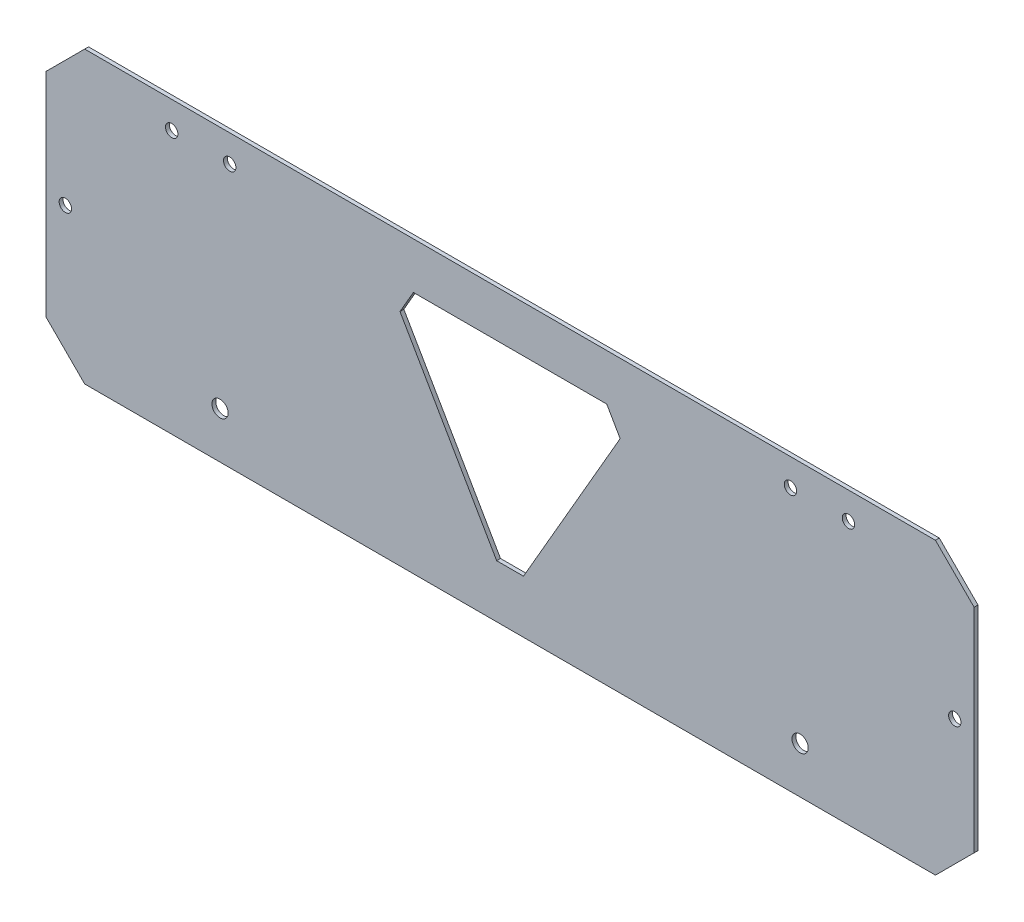
ISO-10303-21;
HEADER;
FILE_DESCRIPTION(('STEP AP214'),'2;1');
FILE_NAME('part.step','',(''),(''),'','','');
FILE_SCHEMA(('AUTOMOTIVE_DESIGN { 1 0 10303 214 1 1 1 1 }'));
ENDSEC;
DATA;
#1=APPLICATION_CONTEXT('core data for automotive mechanical design processes');
#2=APPLICATION_PROTOCOL_DEFINITION('international standard','automotive_design',2000,#1);
#3=PRODUCT_CONTEXT('',#1,'mechanical');
#4=PRODUCT('Part','Part','',(#3));
#5=PRODUCT_RELATED_PRODUCT_CATEGORY('part','',(#4));
#6=PRODUCT_DEFINITION_FORMATION('','',#4);
#7=PRODUCT_DEFINITION_CONTEXT('part definition',#1,'design');
#8=PRODUCT_DEFINITION('design','',#6,#7);
#9=PRODUCT_DEFINITION_SHAPE('','',#8);
#10=(LENGTH_UNIT() NAMED_UNIT(*) SI_UNIT(.MILLI.,.METRE.));
#11=(NAMED_UNIT(*) PLANE_ANGLE_UNIT() SI_UNIT($,.RADIAN.));
#12=(NAMED_UNIT(*) SI_UNIT($,.STERADIAN.) SOLID_ANGLE_UNIT());
#13=UNCERTAINTY_MEASURE_WITH_UNIT(LENGTH_MEASURE(1.E-05),#10,'distance_accuracy_value','');
#14=(GEOMETRIC_REPRESENTATION_CONTEXT(3) GLOBAL_UNCERTAINTY_ASSIGNED_CONTEXT((#13)) GLOBAL_UNIT_ASSIGNED_CONTEXT((#10,
#11,#12)) REPRESENTATION_CONTEXT('',''));
#15=CARTESIAN_POINT('',(0.,0.,0.));
#16=DIRECTION('',(0.,0.,1.));
#17=DIRECTION('',(1.,0.,0.));
#18=AXIS2_PLACEMENT_3D('',#15,#16,#17);
#19=CARTESIAN_POINT('',(0.,0.,1.));
#20=DIRECTION('',(0.,0.,-1.));
#21=DIRECTION('',(-1.,0.,0.));
#22=AXIS2_PLACEMENT_3D('',#19,#20,#21);
#23=PLANE('',#22);
#24=CARTESIAN_POINT('',(47.5,68.,0.999999999999999));
#25=DIRECTION('',(0.,0.,-1.));
#26=DIRECTION('',(-1.,0.,0.));
#27=AXIS2_PLACEMENT_3D('',#24,#25,#26);
#28=CIRCLE('',#27,1.59999999999999);
#29=CARTESIAN_POINT('',(45.9,68.,0.999999999999999));
#30=VERTEX_POINT('',#29);
#31=EDGE_CURVE('E165',#30,#30,#28,.T.);
#32=ORIENTED_EDGE('',*,*,#31,.T.);
#33=EDGE_LOOP('',(#32));
#34=FACE_BOUND('',#33,.T.);
#35=CARTESIAN_POINT('',(192.5,68.,0.999999999999999));
#36=DIRECTION('',(0.,0.,-1.));
#37=DIRECTION('',(-1.,0.,0.));
#38=AXIS2_PLACEMENT_3D('',#35,#36,#37);
#39=CIRCLE('',#38,1.59999999999999);
#40=CARTESIAN_POINT('',(190.9,68.,0.999999999999999));
#41=VERTEX_POINT('',#40);
#42=EDGE_CURVE('E242',#41,#41,#39,.T.);
#43=ORIENTED_EDGE('',*,*,#42,.T.);
#44=EDGE_LOOP('',(#43));
#45=FACE_BOUND('',#44,.T.);
#46=CARTESIAN_POINT('',(207.5,68.,0.999999999999999));
#47=DIRECTION('',(0.,0.,-1.));
#48=DIRECTION('',(-1.,0.,0.));
#49=AXIS2_PLACEMENT_3D('',#46,#47,#48);
#50=CIRCLE('',#49,1.59999999999999);
#51=CARTESIAN_POINT('',(205.9,68.,0.999999999999999));
#52=VERTEX_POINT('',#51);
#53=EDGE_CURVE('E239',#52,#52,#50,.T.);
#54=ORIENTED_EDGE('',*,*,#53,.T.);
#55=EDGE_LOOP('',(#54));
#56=FACE_BOUND('',#55,.T.);
#57=CARTESIAN_POINT('',(45.,12.,0.999999999999999));
#58=DIRECTION('',(0.,0.,-1.));
#59=DIRECTION('',(-1.,0.,0.));
#60=AXIS2_PLACEMENT_3D('',#57,#58,#59);
#61=CIRCLE('',#60,2.1);
#62=CARTESIAN_POINT('',(42.9,12.,0.999999999999999));
#63=VERTEX_POINT('',#62);
#64=EDGE_CURVE('E236',#63,#63,#61,.T.);
#65=ORIENTED_EDGE('',*,*,#64,.T.);
#66=EDGE_LOOP('',(#65));
#67=FACE_BOUND('',#66,.T.);
#68=CARTESIAN_POINT('',(32.5,68.,0.999999999999999));
#69=DIRECTION('',(0.,0.,-1.));
#70=DIRECTION('',(-1.,0.,0.));
#71=AXIS2_PLACEMENT_3D('',#68,#69,#70);
#72=CIRCLE('',#71,1.6);
#73=CARTESIAN_POINT('',(30.9,68.,0.999999999999999));
#74=VERTEX_POINT('',#73);
#75=EDGE_CURVE('E235',#74,#74,#72,.T.);
#76=ORIENTED_EDGE('',*,*,#75,.T.);
#77=EDGE_LOOP('',(#76));
#78=FACE_BOUND('',#77,.T.);
#79=CARTESIAN_POINT('',(235.,37.5,0.999999999999999));
#80=DIRECTION('',(0.,0.,-1.));
#81=DIRECTION('',(-1.,0.,0.));
#82=AXIS2_PLACEMENT_3D('',#79,#80,#81);
#83=CIRCLE('',#82,1.59999999999999);
#84=CARTESIAN_POINT('',(233.4,37.5,0.999999999999999));
#85=VERTEX_POINT('',#84);
#86=EDGE_CURVE('E226',#85,#85,#83,.T.);
#87=ORIENTED_EDGE('',*,*,#86,.T.);
#88=EDGE_LOOP('',(#87));
#89=FACE_BOUND('',#88,.T.);
#90=CARTESIAN_POINT('',(5.,37.5,0.999999999999999));
#91=DIRECTION('',(0.,0.,-1.));
#92=DIRECTION('',(-1.,0.,0.));
#93=AXIS2_PLACEMENT_3D('',#90,#91,#92);
#94=CIRCLE('',#93,1.6);
#95=CARTESIAN_POINT('',(3.4,37.5,0.999999999999999));
#96=VERTEX_POINT('',#95);
#97=EDGE_CURVE('E221',#96,#96,#94,.T.);
#98=ORIENTED_EDGE('',*,*,#97,.T.);
#99=EDGE_LOOP('',(#98));
#100=FACE_BOUND('',#99,.T.);
#101=CARTESIAN_POINT('',(195.,12.,0.999999999999999));
#102=DIRECTION('',(0.,0.,-1.));
#103=DIRECTION('',(-1.,0.,0.));
#104=AXIS2_PLACEMENT_3D('',#101,#102,#103);
#105=CIRCLE('',#104,2.09999999999999);
#106=CARTESIAN_POINT('',(192.9,12.,0.999999999999999));
#107=VERTEX_POINT('',#106);
#108=EDGE_CURVE('E219',#107,#107,#105,.T.);
#109=ORIENTED_EDGE('',*,*,#108,.T.);
#110=EDGE_LOOP('',(#109));
#111=FACE_BOUND('',#110,.T.);
#112=DIRECTION('',(0.,1.,0.));
#113=VECTOR('',#112,1.);
#114=CARTESIAN_POINT('',(240.,0.,1.));
#115=LINE('',#114,#113);
#116=CARTESIAN_POINT('',(240.,10.0000000000001,1.));
#117=VERTEX_POINT('',#116);
#118=CARTESIAN_POINT('',(240.,65.,1.));
#119=VERTEX_POINT('',#118);
#120=EDGE_CURVE('E297',#117,#119,#115,.T.);
#121=ORIENTED_EDGE('',*,*,#120,.T.);
#122=DIRECTION('',(0.707106781186548,-0.707106781186548,0.));
#123=VECTOR('',#122,1.);
#124=CARTESIAN_POINT('',(230.,75.,1.));
#125=LINE('',#124,#123);
#126=CARTESIAN_POINT('',(230.,75.,1.));
#127=VERTEX_POINT('',#126);
#128=EDGE_CURVE('E353',#119,#127,#125,.F.);
#129=ORIENTED_EDGE('',*,*,#128,.T.);
#130=DIRECTION('',(-1.,0.,0.));
#131=VECTOR('',#130,1.);
#132=CARTESIAN_POINT('',(0.,75.,1.));
#133=LINE('',#132,#131);
#134=CARTESIAN_POINT('',(10.,75.,1.));
#135=VERTEX_POINT('',#134);
#136=EDGE_CURVE('E302',#127,#135,#133,.T.);
#137=ORIENTED_EDGE('',*,*,#136,.T.);
#138=DIRECTION('',(0.707106781186548,0.707106781186548,0.));
#139=VECTOR('',#138,1.);
#140=CARTESIAN_POINT('',(0.,65.,1.));
#141=LINE('',#140,#139);
#142=CARTESIAN_POINT('',(0.,65.,1.));
#143=VERTEX_POINT('',#142);
#144=EDGE_CURVE('E350',#135,#143,#141,.F.);
#145=ORIENTED_EDGE('',*,*,#144,.T.);
#146=DIRECTION('',(0.,-1.,0.));
#147=VECTOR('',#146,1.);
#148=CARTESIAN_POINT('',(0.,0.,1.));
#149=LINE('',#148,#147);
#150=CARTESIAN_POINT('',(0.,10.,1.));
#151=VERTEX_POINT('',#150);
#152=EDGE_CURVE('E291',#143,#151,#149,.T.);
#153=ORIENTED_EDGE('',*,*,#152,.T.);
#154=DIRECTION('',(-0.707106781186548,0.707106781186548,0.));
#155=VECTOR('',#154,1.);
#156=CARTESIAN_POINT('',(10.,0.,1.));
#157=LINE('',#156,#155);
#158=CARTESIAN_POINT('',(10.,0.,1.));
#159=VERTEX_POINT('',#158);
#160=EDGE_CURVE('E72',#151,#159,#157,.F.);
#161=ORIENTED_EDGE('',*,*,#160,.T.);
#162=DIRECTION('',(1.,0.,0.));
#163=VECTOR('',#162,1.);
#164=CARTESIAN_POINT('',(0.,0.,1.));
#165=LINE('',#164,#163);
#166=CARTESIAN_POINT('',(230.,0.,1.));
#167=VERTEX_POINT('',#166);
#168=EDGE_CURVE('E298',#159,#167,#165,.T.);
#169=ORIENTED_EDGE('',*,*,#168,.T.);
#170=DIRECTION('',(-0.707106781186548,-0.707106781186548,0.));
#171=VECTOR('',#170,1.);
#172=CARTESIAN_POINT('',(240.,10.0000000000001,1.));
#173=LINE('',#172,#171);
#174=EDGE_CURVE('E355',#167,#117,#173,.F.);
#175=ORIENTED_EDGE('',*,*,#174,.T.);
#176=EDGE_LOOP('',(#121,#129,#137,#145,#153,#161,#169,#175));
#177=FACE_BOUND('',#176,.T.);
#178=DIRECTION('',(0.500000000000001,0.866025403784438,0.));
#179=VECTOR('',#178,1.);
#180=CARTESIAN_POINT('',(86.6746824526943,-50.0416512459885,1.));
#181=LINE('',#180,#179);
#182=CARTESIAN_POINT('',(123.469655114603,13.6891108675447,1.));
#183=VERTEX_POINT('',#182);
#184=CARTESIAN_POINT('',(148.469655114603,56.9903810567666,0.999999999999999));
#185=VERTEX_POINT('',#184);
#186=EDGE_CURVE('E286',#183,#185,#181,.T.);
#187=ORIENTED_EDGE('',*,*,#186,.F.);
#188=DIRECTION('',(-1.,0.,0.));
#189=VECTOR('',#188,1.);
#190=CARTESIAN_POINT('',(123.469655114603,13.6891108675447,1.));
#191=LINE('',#190,#189);
#192=CARTESIAN_POINT('',(116.530344885397,13.6891108675447,1.));
#193=VERTEX_POINT('',#192);
#194=EDGE_CURVE('E175',#183,#193,#191,.T.);
#195=ORIENTED_EDGE('',*,*,#194,.T.);
#196=DIRECTION('',(-0.500000000000001,0.866025403784438,0.));
#197=VECTOR('',#196,1.);
#198=CARTESIAN_POINT('',(93.3253175473054,53.8813972081442,1.));
#199=LINE('',#198,#197);
#200=CARTESIAN_POINT('',(91.5303448853971,56.9903810567666,0.999999999999999));
#201=VERTEX_POINT('',#200);
#202=EDGE_CURVE('E270',#193,#201,#199,.T.);
#203=ORIENTED_EDGE('',*,*,#202,.T.);
#204=DIRECTION('',(0.5,0.866025403784438,0.));
#205=VECTOR('',#204,1.);
#206=CARTESIAN_POINT('',(43.9701997807901,-25.3862066797608,1.));
#207=LINE('',#206,#205);
#208=CARTESIAN_POINT('',(94.9999999999999,63.,0.999999999999999));
#209=VERTEX_POINT('',#208);
#210=EDGE_CURVE('E276',#201,#209,#207,.T.);
#211=ORIENTED_EDGE('',*,*,#210,.T.);
#212=DIRECTION('',(-1.,0.,0.));
#213=VECTOR('',#212,1.);
#214=CARTESIAN_POINT('',(0.,63.,1.));
#215=LINE('',#214,#213);
#216=CARTESIAN_POINT('',(145.,63.,0.999999999999999));
#217=VERTEX_POINT('',#216);
#218=EDGE_CURVE('E283',#217,#209,#215,.T.);
#219=ORIENTED_EDGE('',*,*,#218,.F.);
#220=DIRECTION('',(-0.5,0.866025403784438,0.));
#221=VECTOR('',#220,1.);
#222=CARTESIAN_POINT('',(136.02980021921,78.5368417743719,1.));
#223=LINE('',#222,#221);
#224=EDGE_CURVE('E287',#185,#217,#223,.T.);
#225=ORIENTED_EDGE('',*,*,#224,.F.);
#226=EDGE_LOOP('',(#187,#195,#203,#211,#219,#225));
#227=FACE_BOUND('',#226,.T.);
#228=ADVANCED_FACE('F50',(#34,#45,#56,#67,#78,#89,#100,#111,#177,#227),#23,.F.);
#229=CARTESIAN_POINT('',(0.,0.,0.));
#230=DIRECTION('',(0.,0.,-1.));
#231=DIRECTION('',(-1.,0.,0.));
#232=AXIS2_PLACEMENT_3D('',#229,#230,#231);
#233=PLANE('',#232);
#234=DIRECTION('',(-0.500000000000001,0.866025403784438,0.));
#235=VECTOR('',#234,1.);
#236=CARTESIAN_POINT('',(93.3253175473054,53.8813972081442,0.));
#237=LINE('',#236,#235);
#238=CARTESIAN_POINT('',(116.530344885397,13.6891108675447,0.));
#239=VERTEX_POINT('',#238);
#240=CARTESIAN_POINT('',(91.5303448853971,56.9903810567666,0.));
#241=VERTEX_POINT('',#240);
#242=EDGE_CURVE('E161',#239,#241,#237,.T.);
#243=ORIENTED_EDGE('',*,*,#242,.F.);
#244=DIRECTION('',(-1.,0.,0.));
#245=VECTOR('',#244,1.);
#246=CARTESIAN_POINT('',(123.469655114603,13.6891108675447,0.));
#247=LINE('',#246,#245);
#248=CARTESIAN_POINT('',(123.469655114603,13.6891108675447,0.));
#249=VERTEX_POINT('',#248);
#250=EDGE_CURVE('E167',#249,#239,#247,.T.);
#251=ORIENTED_EDGE('',*,*,#250,.F.);
#252=DIRECTION('',(0.500000000000001,0.866025403784438,0.));
#253=VECTOR('',#252,1.);
#254=CARTESIAN_POINT('',(86.6746824526943,-50.0416512459885,0.));
#255=LINE('',#254,#253);
#256=CARTESIAN_POINT('',(148.469655114603,56.9903810567666,0.));
#257=VERTEX_POINT('',#256);
#258=EDGE_CURVE('E151',#249,#257,#255,.T.);
#259=ORIENTED_EDGE('',*,*,#258,.T.);
#260=DIRECTION('',(-0.5,0.866025403784438,0.));
#261=VECTOR('',#260,1.);
#262=CARTESIAN_POINT('',(136.02980021921,78.5368417743719,0.));
#263=LINE('',#262,#261);
#264=CARTESIAN_POINT('',(145.,63.,0.));
#265=VERTEX_POINT('',#264);
#266=EDGE_CURVE('E261',#257,#265,#263,.T.);
#267=ORIENTED_EDGE('',*,*,#266,.T.);
#268=DIRECTION('',(-1.,0.,0.));
#269=VECTOR('',#268,1.);
#270=CARTESIAN_POINT('',(0.,63.,0.));
#271=LINE('',#270,#269);
#272=CARTESIAN_POINT('',(94.9999999999999,63.,0.));
#273=VERTEX_POINT('',#272);
#274=EDGE_CURVE('E260',#265,#273,#271,.T.);
#275=ORIENTED_EDGE('',*,*,#274,.T.);
#276=DIRECTION('',(0.5,0.866025403784438,0.));
#277=VECTOR('',#276,1.);
#278=CARTESIAN_POINT('',(43.9701997807901,-25.3862066797608,0.));
#279=LINE('',#278,#277);
#280=EDGE_CURVE('E254',#241,#273,#279,.T.);
#281=ORIENTED_EDGE('',*,*,#280,.F.);
#282=EDGE_LOOP('',(#243,#251,#259,#267,#275,#281));
#283=FACE_BOUND('',#282,.T.);
#284=CARTESIAN_POINT('',(47.5,68.,0.));
#285=DIRECTION('',(0.,0.,-1.));
#286=DIRECTION('',(1.,0.,0.));
#287=AXIS2_PLACEMENT_3D('',#284,#285,#286);
#288=CIRCLE('',#287,1.59999999999999);
#289=CARTESIAN_POINT('',(49.1,68.,0.));
#290=VERTEX_POINT('',#289);
#291=EDGE_CURVE('E194',#290,#290,#288,.T.);
#292=ORIENTED_EDGE('',*,*,#291,.F.);
#293=EDGE_LOOP('',(#292));
#294=FACE_BOUND('',#293,.T.);
#295=CARTESIAN_POINT('',(192.5,68.,0.));
#296=DIRECTION('',(0.,0.,-1.));
#297=DIRECTION('',(-1.,0.,0.));
#298=AXIS2_PLACEMENT_3D('',#295,#296,#297);
#299=CIRCLE('',#298,1.59999999999999);
#300=CARTESIAN_POINT('',(190.9,68.,0.));
#301=VERTEX_POINT('',#300);
#302=EDGE_CURVE('E202',#301,#301,#299,.T.);
#303=ORIENTED_EDGE('',*,*,#302,.F.);
#304=EDGE_LOOP('',(#303));
#305=FACE_BOUND('',#304,.T.);
#306=CARTESIAN_POINT('',(207.5,68.,0.));
#307=DIRECTION('',(0.,0.,-1.));
#308=DIRECTION('',(-1.,0.,0.));
#309=AXIS2_PLACEMENT_3D('',#306,#307,#308);
#310=CIRCLE('',#309,1.59999999999999);
#311=CARTESIAN_POINT('',(205.9,68.,0.));
#312=VERTEX_POINT('',#311);
#313=EDGE_CURVE('E203',#312,#312,#310,.T.);
#314=ORIENTED_EDGE('',*,*,#313,.F.);
#315=EDGE_LOOP('',(#314));
#316=FACE_BOUND('',#315,.T.);
#317=CARTESIAN_POINT('',(45.,12.,0.));
#318=DIRECTION('',(0.,0.,-1.));
#319=DIRECTION('',(-1.,0.,0.));
#320=AXIS2_PLACEMENT_3D('',#317,#318,#319);
#321=CIRCLE('',#320,2.1);
#322=CARTESIAN_POINT('',(42.9,12.,0.));
#323=VERTEX_POINT('',#322);
#324=EDGE_CURVE('E209',#323,#323,#321,.T.);
#325=ORIENTED_EDGE('',*,*,#324,.F.);
#326=EDGE_LOOP('',(#325));
#327=FACE_BOUND('',#326,.T.);
#328=CARTESIAN_POINT('',(32.5,68.,0.));
#329=DIRECTION('',(0.,0.,-1.));
#330=DIRECTION('',(1.,0.,0.));
#331=AXIS2_PLACEMENT_3D('',#328,#329,#330);
#332=CIRCLE('',#331,1.6);
#333=CARTESIAN_POINT('',(34.1,68.,0.));
#334=VERTEX_POINT('',#333);
#335=EDGE_CURVE('E186',#334,#334,#332,.T.);
#336=ORIENTED_EDGE('',*,*,#335,.F.);
#337=EDGE_LOOP('',(#336));
#338=FACE_BOUND('',#337,.T.);
#339=CARTESIAN_POINT('',(235.,37.5,0.));
#340=DIRECTION('',(0.,0.,-1.));
#341=DIRECTION('',(-1.,0.,0.));
#342=AXIS2_PLACEMENT_3D('',#339,#340,#341);
#343=CIRCLE('',#342,1.59999999999999);
#344=CARTESIAN_POINT('',(233.4,37.5,0.));
#345=VERTEX_POINT('',#344);
#346=EDGE_CURVE('E191',#345,#345,#343,.T.);
#347=ORIENTED_EDGE('',*,*,#346,.F.);
#348=EDGE_LOOP('',(#347));
#349=FACE_BOUND('',#348,.T.);
#350=CARTESIAN_POINT('',(5.,37.5,0.));
#351=DIRECTION('',(0.,0.,-1.));
#352=DIRECTION('',(-1.,0.,0.));
#353=AXIS2_PLACEMENT_3D('',#350,#351,#352);
#354=CIRCLE('',#353,1.6);
#355=CARTESIAN_POINT('',(3.4,37.5,0.));
#356=VERTEX_POINT('',#355);
#357=EDGE_CURVE('E190',#356,#356,#354,.T.);
#358=ORIENTED_EDGE('',*,*,#357,.F.);
#359=EDGE_LOOP('',(#358));
#360=FACE_BOUND('',#359,.T.);
#361=CARTESIAN_POINT('',(195.,12.,0.));
#362=DIRECTION('',(0.,0.,-1.));
#363=DIRECTION('',(-1.,0.,0.));
#364=AXIS2_PLACEMENT_3D('',#361,#362,#363);
#365=CIRCLE('',#364,2.09999999999999);
#366=CARTESIAN_POINT('',(192.9,12.,0.));
#367=VERTEX_POINT('',#366);
#368=EDGE_CURVE('E214',#367,#367,#365,.T.);
#369=ORIENTED_EDGE('',*,*,#368,.F.);
#370=EDGE_LOOP('',(#369));
#371=FACE_BOUND('',#370,.T.);
#372=DIRECTION('',(-1.,0.,0.));
#373=VECTOR('',#372,1.);
#374=CARTESIAN_POINT('',(0.,75.,0.));
#375=LINE('',#374,#373);
#376=CARTESIAN_POINT('',(230.,75.,0.));
#377=VERTEX_POINT('',#376);
#378=CARTESIAN_POINT('',(10.,75.,0.));
#379=VERTEX_POINT('',#378);
#380=EDGE_CURVE('E300',#377,#379,#375,.T.);
#381=ORIENTED_EDGE('',*,*,#380,.F.);
#382=DIRECTION('',(-0.707106781186548,0.707106781186548,0.));
#383=VECTOR('',#382,1.);
#384=CARTESIAN_POINT('',(152.5,152.5,0.));
#385=LINE('',#384,#383);
#386=CARTESIAN_POINT('',(240.,65.,0.));
#387=VERTEX_POINT('',#386);
#388=EDGE_CURVE('E340',#377,#387,#385,.F.);
#389=ORIENTED_EDGE('',*,*,#388,.T.);
#390=DIRECTION('',(0.,1.,0.));
#391=VECTOR('',#390,1.);
#392=CARTESIAN_POINT('',(240.,0.,0.));
#393=LINE('',#392,#391);
#394=CARTESIAN_POINT('',(240.,10.0000000000001,0.));
#395=VERTEX_POINT('',#394);
#396=EDGE_CURVE('E314',#395,#387,#393,.T.);
#397=ORIENTED_EDGE('',*,*,#396,.F.);
#398=DIRECTION('',(0.707106781186548,0.707106781186548,0.));
#399=VECTOR('',#398,1.);
#400=CARTESIAN_POINT('',(115.,-115.,0.));
#401=LINE('',#400,#399);
#402=CARTESIAN_POINT('',(230.,0.,0.));
#403=VERTEX_POINT('',#402);
#404=EDGE_CURVE('E331',#395,#403,#401,.F.);
#405=ORIENTED_EDGE('',*,*,#404,.T.);
#406=DIRECTION('',(1.,0.,0.));
#407=VECTOR('',#406,1.);
#408=CARTESIAN_POINT('',(0.,0.,0.));
#409=LINE('',#408,#407);
#410=CARTESIAN_POINT('',(10.,0.,0.));
#411=VERTEX_POINT('',#410);
#412=EDGE_CURVE('E315',#411,#403,#409,.T.);
#413=ORIENTED_EDGE('',*,*,#412,.F.);
#414=DIRECTION('',(0.707106781186548,-0.707106781186548,0.));
#415=VECTOR('',#414,1.);
#416=CARTESIAN_POINT('',(5.00000000000002,5.00000000000002,0.));
#417=LINE('',#416,#415);
#418=CARTESIAN_POINT('',(0.,10.,0.));
#419=VERTEX_POINT('',#418);
#420=EDGE_CURVE('E332',#411,#419,#417,.F.);
#421=ORIENTED_EDGE('',*,*,#420,.T.);
#422=DIRECTION('',(0.,-1.,0.));
#423=VECTOR('',#422,1.);
#424=CARTESIAN_POINT('',(0.,0.,0.));
#425=LINE('',#424,#423);
#426=CARTESIAN_POINT('',(0.,65.,0.));
#427=VERTEX_POINT('',#426);
#428=EDGE_CURVE('E292',#427,#419,#425,.T.);
#429=ORIENTED_EDGE('',*,*,#428,.F.);
#430=DIRECTION('',(-0.707106781186548,-0.707106781186548,0.));
#431=VECTOR('',#430,1.);
#432=CARTESIAN_POINT('',(-32.5,32.5,0.));
#433=LINE('',#432,#431);
#434=EDGE_CURVE('E328',#427,#379,#433,.F.);
#435=ORIENTED_EDGE('',*,*,#434,.T.);
#436=EDGE_LOOP('',(#381,#389,#397,#405,#413,#421,#429,#435));
#437=FACE_BOUND('',#436,.T.);
#438=ADVANCED_FACE('F176',(#283,#294,#305,#316,#327,#338,#349,#360,#371,#437),#233,.T.);
#439=CARTESIAN_POINT('',(0.,0.,1.));
#440=DIRECTION('',(1.,0.,0.));
#441=DIRECTION('',(0.,0.,-1.));
#442=AXIS2_PLACEMENT_3D('',#439,#440,#441);
#443=PLANE('',#442);
#444=ORIENTED_EDGE('',*,*,#428,.T.);
#445=DIRECTION('',(0.,0.,1.));
#446=VECTOR('',#445,1.);
#447=CARTESIAN_POINT('',(0.,10.,1.));
#448=LINE('',#447,#446);
#449=EDGE_CURVE('E11',#419,#151,#448,.T.);
#450=ORIENTED_EDGE('',*,*,#449,.T.);
#451=ORIENTED_EDGE('',*,*,#152,.F.);
#452=DIRECTION('',(0.,0.,-1.));
#453=VECTOR('',#452,1.);
#454=CARTESIAN_POINT('',(0.,65.,1.));
#455=LINE('',#454,#453);
#456=EDGE_CURVE('E60',#143,#427,#455,.T.);
#457=ORIENTED_EDGE('',*,*,#456,.T.);
#458=EDGE_LOOP('',(#444,#450,#451,#457));
#459=FACE_BOUND('',#458,.T.);
#460=ADVANCED_FACE('F367',(#459),#443,.F.);
#461=CARTESIAN_POINT('',(0.,0.,1.));
#462=DIRECTION('',(0.,1.,0.));
#463=DIRECTION('',(-1.,0.,0.));
#464=AXIS2_PLACEMENT_3D('',#461,#462,#463);
#465=PLANE('',#464);
#466=ORIENTED_EDGE('',*,*,#412,.T.);
#467=DIRECTION('',(0.,0.,1.));
#468=VECTOR('',#467,1.);
#469=CARTESIAN_POINT('',(230.,0.,1.));
#470=LINE('',#469,#468);
#471=EDGE_CURVE('E61',#403,#167,#470,.T.);
#472=ORIENTED_EDGE('',*,*,#471,.T.);
#473=ORIENTED_EDGE('',*,*,#168,.F.);
#474=DIRECTION('',(0.,0.,-1.));
#475=VECTOR('',#474,1.);
#476=CARTESIAN_POINT('',(10.,0.,1.));
#477=LINE('',#476,#475);
#478=EDGE_CURVE('E356',#159,#411,#477,.T.);
#479=ORIENTED_EDGE('',*,*,#478,.T.);
#480=EDGE_LOOP('',(#466,#472,#473,#479));
#481=FACE_BOUND('',#480,.T.);
#482=ADVANCED_FACE('F378',(#481),#465,.F.);
#483=CARTESIAN_POINT('',(240.,0.,1.));
#484=DIRECTION('',(-1.,0.,0.));
#485=DIRECTION('',(0.,-1.,0.));
#486=AXIS2_PLACEMENT_3D('',#483,#484,#485);
#487=PLANE('',#486);
#488=ORIENTED_EDGE('',*,*,#396,.T.);
#489=DIRECTION('',(0.,0.,1.));
#490=VECTOR('',#489,1.);
#491=CARTESIAN_POINT('',(240.,65.,1.));
#492=LINE('',#491,#490);
#493=EDGE_CURVE('E341',#387,#119,#492,.T.);
#494=ORIENTED_EDGE('',*,*,#493,.T.);
#495=ORIENTED_EDGE('',*,*,#120,.F.);
#496=DIRECTION('',(0.,0.,-1.));
#497=VECTOR('',#496,1.);
#498=CARTESIAN_POINT('',(240.,10.0000000000001,1.));
#499=LINE('',#498,#497);
#500=EDGE_CURVE('E338',#117,#395,#499,.T.);
#501=ORIENTED_EDGE('',*,*,#500,.T.);
#502=EDGE_LOOP('',(#488,#494,#495,#501));
#503=FACE_BOUND('',#502,.T.);
#504=ADVANCED_FACE('F389',(#503),#487,.F.);
#505=CARTESIAN_POINT('',(0.,75.,1.));
#506=DIRECTION('',(0.,-1.,0.));
#507=DIRECTION('',(1.,0.,0.));
#508=AXIS2_PLACEMENT_3D('',#505,#506,#507);
#509=PLANE('',#508);
#510=ORIENTED_EDGE('',*,*,#136,.F.);
#511=DIRECTION('',(0.,0.,-1.));
#512=VECTOR('',#511,1.);
#513=CARTESIAN_POINT('',(230.,75.,1.));
#514=LINE('',#513,#512);
#515=EDGE_CURVE('E321',#127,#377,#514,.T.);
#516=ORIENTED_EDGE('',*,*,#515,.T.);
#517=ORIENTED_EDGE('',*,*,#380,.T.);
#518=DIRECTION('',(0.,0.,1.));
#519=VECTOR('',#518,1.);
#520=CARTESIAN_POINT('',(10.,75.,1.));
#521=LINE('',#520,#519);
#522=EDGE_CURVE('E308',#379,#135,#521,.T.);
#523=ORIENTED_EDGE('',*,*,#522,.T.);
#524=EDGE_LOOP('',(#510,#516,#517,#523));
#525=FACE_BOUND('',#524,.T.);
#526=ADVANCED_FACE('F397',(#525),#509,.F.);
#527=CARTESIAN_POINT('',(230.,75.,1.));
#528=DIRECTION('',(-0.707106781186547,-0.707106781186547,0.));
#529=DIRECTION('',(0.,0.,-1.));
#530=AXIS2_PLACEMENT_3D('',#527,#528,#529);
#531=PLANE('',#530);
#532=ORIENTED_EDGE('',*,*,#128,.F.);
#533=ORIENTED_EDGE('',*,*,#493,.F.);
#534=ORIENTED_EDGE('',*,*,#388,.F.);
#535=ORIENTED_EDGE('',*,*,#515,.F.);
#536=EDGE_LOOP('',(#532,#533,#534,#535));
#537=FACE_BOUND('',#536,.T.);
#538=ADVANCED_FACE('F393',(#537),#531,.F.);
#539=CARTESIAN_POINT('',(240.,10.0000000000001,1.));
#540=DIRECTION('',(-0.707106781186547,0.707106781186547,0.));
#541=DIRECTION('',(0.,0.,-1.));
#542=AXIS2_PLACEMENT_3D('',#539,#540,#541);
#543=PLANE('',#542);
#544=ORIENTED_EDGE('',*,*,#174,.F.);
#545=ORIENTED_EDGE('',*,*,#471,.F.);
#546=ORIENTED_EDGE('',*,*,#404,.F.);
#547=ORIENTED_EDGE('',*,*,#500,.F.);
#548=EDGE_LOOP('',(#544,#545,#546,#547));
#549=FACE_BOUND('',#548,.T.);
#550=ADVANCED_FACE('F383',(#549),#543,.F.);
#551=CARTESIAN_POINT('',(10.,0.,1.));
#552=DIRECTION('',(0.707106781186547,0.707106781186547,0.));
#553=DIRECTION('',(0.,0.,-1.));
#554=AXIS2_PLACEMENT_3D('',#551,#552,#553);
#555=PLANE('',#554);
#556=ORIENTED_EDGE('',*,*,#160,.F.);
#557=ORIENTED_EDGE('',*,*,#449,.F.);
#558=ORIENTED_EDGE('',*,*,#420,.F.);
#559=ORIENTED_EDGE('',*,*,#478,.F.);
#560=EDGE_LOOP('',(#556,#557,#558,#559));
#561=FACE_BOUND('',#560,.T.);
#562=ADVANCED_FACE('F377',(#561),#555,.F.);
#563=CARTESIAN_POINT('',(0.,65.,1.));
#564=DIRECTION('',(0.707106781186547,-0.707106781186547,0.));
#565=DIRECTION('',(0.,0.,-1.));
#566=AXIS2_PLACEMENT_3D('',#563,#564,#565);
#567=PLANE('',#566);
#568=ORIENTED_EDGE('',*,*,#144,.F.);
#569=ORIENTED_EDGE('',*,*,#522,.F.);
#570=ORIENTED_EDGE('',*,*,#434,.F.);
#571=ORIENTED_EDGE('',*,*,#456,.F.);
#572=EDGE_LOOP('',(#568,#569,#570,#571));
#573=FACE_BOUND('',#572,.T.);
#574=ADVANCED_FACE('F49',(#573),#567,.F.);
#575=CARTESIAN_POINT('',(86.6746824526943,-50.0416512459885,10.));
#576=DIRECTION('',(-0.866025403784438,0.500000000000001,0.));
#577=DIRECTION('',(-0.500000000000001,-0.866025403784438,0.));
#578=AXIS2_PLACEMENT_3D('',#575,#576,#577);
#579=PLANE('',#578);
#580=ORIENTED_EDGE('',*,*,#186,.T.);
#581=DIRECTION('',(0.,0.,-1.));
#582=VECTOR('',#581,1.);
#583=CARTESIAN_POINT('',(148.469655114603,56.9903810567666,10.));
#584=LINE('',#583,#582);
#585=EDGE_CURVE('E160',#185,#257,#584,.T.);
#586=ORIENTED_EDGE('',*,*,#585,.T.);
#587=ORIENTED_EDGE('',*,*,#258,.F.);
#588=DIRECTION('',(0.,0.,1.));
#589=VECTOR('',#588,1.);
#590=CARTESIAN_POINT('',(123.469655114603,13.6891108675447,0.));
#591=LINE('',#590,#589);
#592=EDGE_CURVE('E152',#249,#183,#591,.T.);
#593=ORIENTED_EDGE('',*,*,#592,.T.);
#594=EDGE_LOOP('',(#580,#586,#587,#593));
#595=FACE_BOUND('',#594,.T.);
#596=ADVANCED_FACE('F153',(#595),#579,.T.);
#597=CARTESIAN_POINT('',(136.02980021921,78.5368417743719,10.));
#598=DIRECTION('',(-0.866025403784438,-0.5,0.));
#599=DIRECTION('',(0.5,-0.866025403784438,0.));
#600=AXIS2_PLACEMENT_3D('',#597,#598,#599);
#601=PLANE('',#600);
#602=ORIENTED_EDGE('',*,*,#224,.T.);
#603=DIRECTION('',(0.,0.,-1.));
#604=VECTOR('',#603,1.);
#605=CARTESIAN_POINT('',(145.,63.,10.));
#606=LINE('',#605,#604);
#607=EDGE_CURVE('E269',#217,#265,#606,.T.);
#608=ORIENTED_EDGE('',*,*,#607,.T.);
#609=ORIENTED_EDGE('',*,*,#266,.F.);
#610=ORIENTED_EDGE('',*,*,#585,.F.);
#611=EDGE_LOOP('',(#602,#608,#609,#610));
#612=FACE_BOUND('',#611,.T.);
#613=ADVANCED_FACE('F404',(#612),#601,.T.);
#614=CARTESIAN_POINT('',(0.,63.,10.));
#615=DIRECTION('',(0.,-1.,0.));
#616=DIRECTION('',(0.,0.,-1.));
#617=AXIS2_PLACEMENT_3D('',#614,#615,#616);
#618=PLANE('',#617);
#619=ORIENTED_EDGE('',*,*,#218,.T.);
#620=DIRECTION('',(0.,0.,-1.));
#621=VECTOR('',#620,1.);
#622=CARTESIAN_POINT('',(94.9999999999999,63.,10.));
#623=LINE('',#622,#621);
#624=EDGE_CURVE('E272',#209,#273,#623,.T.);
#625=ORIENTED_EDGE('',*,*,#624,.T.);
#626=ORIENTED_EDGE('',*,*,#274,.F.);
#627=ORIENTED_EDGE('',*,*,#607,.F.);
#628=EDGE_LOOP('',(#619,#625,#626,#627));
#629=FACE_BOUND('',#628,.T.);
#630=ADVANCED_FACE('F482',(#629),#618,.T.);
#631=CARTESIAN_POINT('',(43.9701997807901,-25.3862066797608,10.));
#632=DIRECTION('',(-0.866025403784438,0.5,0.));
#633=DIRECTION('',(-0.5,-0.866025403784438,0.));
#634=AXIS2_PLACEMENT_3D('',#631,#632,#633);
#635=PLANE('',#634);
#636=DIRECTION('',(0.,0.,-1.));
#637=VECTOR('',#636,1.);
#638=CARTESIAN_POINT('',(91.5303448853971,56.9903810567666,10.));
#639=LINE('',#638,#637);
#640=EDGE_CURVE('E262',#201,#241,#639,.T.);
#641=ORIENTED_EDGE('',*,*,#640,.T.);
#642=ORIENTED_EDGE('',*,*,#280,.T.);
#643=ORIENTED_EDGE('',*,*,#624,.F.);
#644=ORIENTED_EDGE('',*,*,#210,.F.);
#645=EDGE_LOOP('',(#641,#642,#643,#644));
#646=FACE_BOUND('',#645,.T.);
#647=ADVANCED_FACE('F493',(#646),#635,.F.);
#648=CARTESIAN_POINT('',(93.3253175473054,53.8813972081442,10.));
#649=DIRECTION('',(-0.866025403784438,-0.500000000000001,0.));
#650=DIRECTION('',(0.500000000000001,-0.866025403784438,0.));
#651=AXIS2_PLACEMENT_3D('',#648,#649,#650);
#652=PLANE('',#651);
#653=ORIENTED_EDGE('',*,*,#202,.F.);
#654=DIRECTION('',(0.,0.,1.));
#655=VECTOR('',#654,1.);
#656=CARTESIAN_POINT('',(116.530344885397,13.6891108675447,0.));
#657=LINE('',#656,#655);
#658=EDGE_CURVE('E172',#239,#193,#657,.T.);
#659=ORIENTED_EDGE('',*,*,#658,.F.);
#660=ORIENTED_EDGE('',*,*,#242,.T.);
#661=ORIENTED_EDGE('',*,*,#640,.F.);
#662=EDGE_LOOP('',(#653,#659,#660,#661));
#663=FACE_BOUND('',#662,.T.);
#664=ADVANCED_FACE('F501',(#663),#652,.F.);
#665=CARTESIAN_POINT('',(195.,12.,10.));
#666=DIRECTION('',(0.,0.,-1.));
#667=DIRECTION('',(-1.,0.,0.));
#668=AXIS2_PLACEMENT_3D('',#665,#666,#667);
#669=CYLINDRICAL_SURFACE('',#668,2.09999999999999);
#670=ORIENTED_EDGE('',*,*,#368,.T.);
#671=EDGE_LOOP('',(#670));
#672=FACE_BOUND('',#671,.T.);
#673=ORIENTED_EDGE('',*,*,#108,.F.);
#674=EDGE_LOOP('',(#673));
#675=FACE_BOUND('',#674,.T.);
#676=ADVANCED_FACE('F515',(#672,#675),#669,.F.);
#677=CARTESIAN_POINT('',(5.,37.5,10.));
#678=DIRECTION('',(0.,0.,-1.));
#679=DIRECTION('',(-1.,0.,0.));
#680=AXIS2_PLACEMENT_3D('',#677,#678,#679);
#681=CYLINDRICAL_SURFACE('',#680,1.6);
#682=ORIENTED_EDGE('',*,*,#357,.T.);
#683=EDGE_LOOP('',(#682));
#684=FACE_BOUND('',#683,.T.);
#685=ORIENTED_EDGE('',*,*,#97,.F.);
#686=EDGE_LOOP('',(#685));
#687=FACE_BOUND('',#686,.T.);
#688=ADVANCED_FACE('F525',(#684,#687),#681,.F.);
#689=CARTESIAN_POINT('',(235.,37.5,10.));
#690=DIRECTION('',(0.,0.,-1.));
#691=DIRECTION('',(-1.,0.,0.));
#692=AXIS2_PLACEMENT_3D('',#689,#690,#691);
#693=CYLINDRICAL_SURFACE('',#692,1.59999999999999);
#694=ORIENTED_EDGE('',*,*,#346,.T.);
#695=EDGE_LOOP('',(#694));
#696=FACE_BOUND('',#695,.T.);
#697=ORIENTED_EDGE('',*,*,#86,.F.);
#698=EDGE_LOOP('',(#697));
#699=FACE_BOUND('',#698,.T.);
#700=ADVANCED_FACE('F535',(#696,#699),#693,.F.);
#701=CARTESIAN_POINT('',(32.5,68.,10.));
#702=DIRECTION('',(0.,0.,-1.));
#703=DIRECTION('',(-1.,0.,0.));
#704=AXIS2_PLACEMENT_3D('',#701,#702,#703);
#705=CYLINDRICAL_SURFACE('',#704,1.6);
#706=ORIENTED_EDGE('',*,*,#335,.T.);
#707=EDGE_LOOP('',(#706));
#708=FACE_BOUND('',#707,.T.);
#709=ORIENTED_EDGE('',*,*,#75,.F.);
#710=EDGE_LOOP('',(#709));
#711=FACE_BOUND('',#710,.T.);
#712=ADVANCED_FACE('F545',(#708,#711),#705,.F.);
#713=CARTESIAN_POINT('',(45.,12.,10.));
#714=DIRECTION('',(0.,0.,-1.));
#715=DIRECTION('',(-1.,0.,0.));
#716=AXIS2_PLACEMENT_3D('',#713,#714,#715);
#717=CYLINDRICAL_SURFACE('',#716,2.1);
#718=ORIENTED_EDGE('',*,*,#324,.T.);
#719=EDGE_LOOP('',(#718));
#720=FACE_BOUND('',#719,.T.);
#721=ORIENTED_EDGE('',*,*,#64,.F.);
#722=EDGE_LOOP('',(#721));
#723=FACE_BOUND('',#722,.T.);
#724=ADVANCED_FACE('F552',(#720,#723),#717,.F.);
#725=CARTESIAN_POINT('',(207.5,68.,10.));
#726=DIRECTION('',(0.,0.,-1.));
#727=DIRECTION('',(-1.,0.,0.));
#728=AXIS2_PLACEMENT_3D('',#725,#726,#727);
#729=CYLINDRICAL_SURFACE('',#728,1.59999999999999);
#730=ORIENTED_EDGE('',*,*,#313,.T.);
#731=EDGE_LOOP('',(#730));
#732=FACE_BOUND('',#731,.T.);
#733=ORIENTED_EDGE('',*,*,#53,.F.);
#734=EDGE_LOOP('',(#733));
#735=FACE_BOUND('',#734,.T.);
#736=ADVANCED_FACE('F565',(#732,#735),#729,.F.);
#737=CARTESIAN_POINT('',(192.5,68.,10.));
#738=DIRECTION('',(0.,0.,-1.));
#739=DIRECTION('',(-1.,0.,0.));
#740=AXIS2_PLACEMENT_3D('',#737,#738,#739);
#741=CYLINDRICAL_SURFACE('',#740,1.59999999999999);
#742=ORIENTED_EDGE('',*,*,#302,.T.);
#743=EDGE_LOOP('',(#742));
#744=FACE_BOUND('',#743,.T.);
#745=ORIENTED_EDGE('',*,*,#42,.F.);
#746=EDGE_LOOP('',(#745));
#747=FACE_BOUND('',#746,.T.);
#748=ADVANCED_FACE('F575',(#744,#747),#741,.F.);
#749=CARTESIAN_POINT('',(47.5,68.,10.));
#750=DIRECTION('',(0.,0.,-1.));
#751=DIRECTION('',(-1.,0.,0.));
#752=AXIS2_PLACEMENT_3D('',#749,#750,#751);
#753=CYLINDRICAL_SURFACE('',#752,1.59999999999999);
#754=ORIENTED_EDGE('',*,*,#291,.T.);
#755=EDGE_LOOP('',(#754));
#756=FACE_BOUND('',#755,.T.);
#757=ORIENTED_EDGE('',*,*,#31,.F.);
#758=EDGE_LOOP('',(#757));
#759=FACE_BOUND('',#758,.T.);
#760=ADVANCED_FACE('F585',(#756,#759),#753,.F.);
#761=CARTESIAN_POINT('',(123.469655114603,13.6891108675447,0.));
#762=DIRECTION('',(0.,1.,0.));
#763=DIRECTION('',(-1.,0.,0.));
#764=AXIS2_PLACEMENT_3D('',#761,#762,#763);
#765=PLANE('',#764);
#766=ORIENTED_EDGE('',*,*,#194,.F.);
#767=ORIENTED_EDGE('',*,*,#592,.F.);
#768=ORIENTED_EDGE('',*,*,#250,.T.);
#769=ORIENTED_EDGE('',*,*,#658,.T.);
#770=EDGE_LOOP('',(#766,#767,#768,#769));
#771=FACE_BOUND('',#770,.T.);
#772=ADVANCED_FACE('F166',(#771),#765,.T.);
#773=CLOSED_SHELL('',(#228,#438,#460,#482,#504,#526,#538,#550,#562,#574,#596,#613,#630,#647,
#664,#676,#688,#700,#712,#724,#736,#748,#760,#772));
#774=MANIFOLD_SOLID_BREP('B2',#773);
#775=ADVANCED_BREP_SHAPE_REPRESENTATION('',(#18,#774),#14);
#776=SHAPE_DEFINITION_REPRESENTATION(#9,#775);
ENDSEC;
END-ISO-10303-21;
